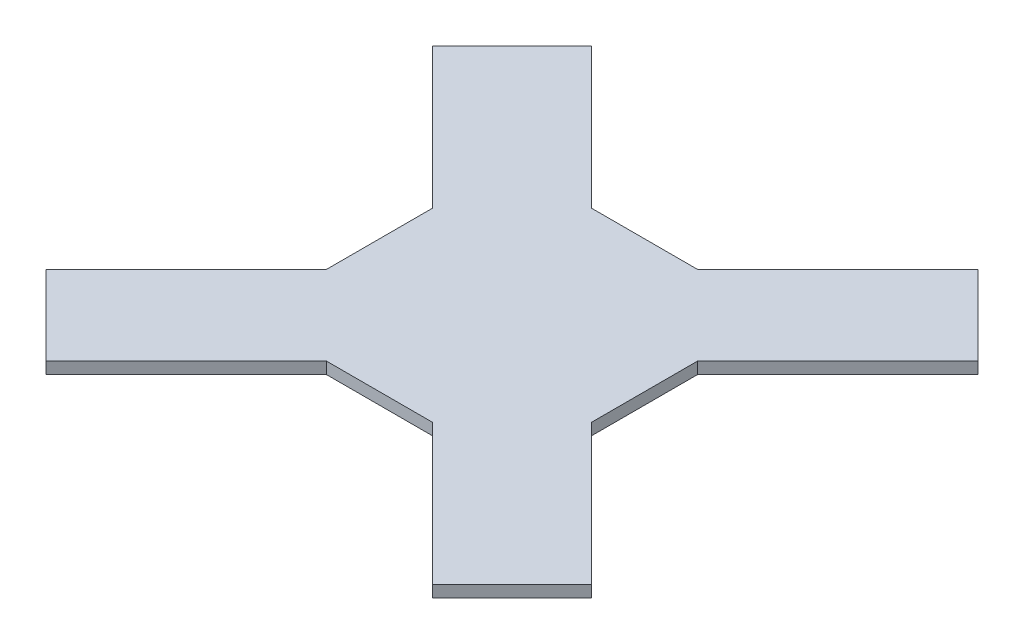
ISO-10303-21;
HEADER;
FILE_DESCRIPTION(('STEP AP214'),'2;1');
FILE_NAME('part.step','',(''),(''),'','','');
FILE_SCHEMA(('AUTOMOTIVE_DESIGN { 1 0 10303 214 1 1 1 1 }'));
ENDSEC;
DATA;
#1=APPLICATION_CONTEXT('core data for automotive mechanical design processes');
#2=APPLICATION_PROTOCOL_DEFINITION('international standard','automotive_design',2000,#1);
#3=PRODUCT_CONTEXT('',#1,'mechanical');
#4=PRODUCT('Part','Part','',(#3));
#5=PRODUCT_RELATED_PRODUCT_CATEGORY('part','',(#4));
#6=PRODUCT_DEFINITION_FORMATION('','',#4);
#7=PRODUCT_DEFINITION_CONTEXT('part definition',#1,'design');
#8=PRODUCT_DEFINITION('design','',#6,#7);
#9=PRODUCT_DEFINITION_SHAPE('','',#8);
#10=(LENGTH_UNIT() NAMED_UNIT(*) SI_UNIT(.MILLI.,.METRE.));
#11=(NAMED_UNIT(*) PLANE_ANGLE_UNIT() SI_UNIT($,.RADIAN.));
#12=(NAMED_UNIT(*) SI_UNIT($,.STERADIAN.) SOLID_ANGLE_UNIT());
#13=UNCERTAINTY_MEASURE_WITH_UNIT(LENGTH_MEASURE(1.E-05),#10,'distance_accuracy_value','');
#14=(GEOMETRIC_REPRESENTATION_CONTEXT(3) GLOBAL_UNCERTAINTY_ASSIGNED_CONTEXT((#13)) GLOBAL_UNIT_ASSIGNED_CONTEXT((#10,
#11,#12)) REPRESENTATION_CONTEXT('',''));
#15=CARTESIAN_POINT('',(0.,0.,0.));
#16=DIRECTION('',(0.,0.,1.));
#17=DIRECTION('',(1.,0.,0.));
#18=AXIS2_PLACEMENT_3D('',#15,#16,#17);
#19=CARTESIAN_POINT('',(-232.530110784354,10.,-164.647859790445));
#20=DIRECTION('',(0.707106781186547,0.,-0.707106781186548));
#21=DIRECTION('',(-0.707106781186548,0.,-0.707106781186547));
#22=AXIS2_PLACEMENT_3D('',#19,#20,#21);
#23=PLANE('',#22);
#24=DIRECTION('',(0.707106781186548,0.,0.707106781186547));
#25=VECTOR('',#24,1.);
#26=CARTESIAN_POINT('',(-232.530110784354,0.,-164.647859790445));
#27=LINE('',#26,#25);
#28=CARTESIAN_POINT('',(-232.530110784354,0.,-164.647859790445));
#29=VERTEX_POINT('',#28);
#30=CARTESIAN_POINT('',(-112.798741958208,0.,-44.9164909642999));
#31=VERTEX_POINT('',#30);
#32=EDGE_CURVE('E194',#29,#31,#27,.T.);
#33=ORIENTED_EDGE('',*,*,#32,.T.);
#34=DIRECTION('',(0.,-1.,0.));
#35=VECTOR('',#34,1.);
#36=CARTESIAN_POINT('',(-112.798741958208,10.,-44.9164909642999));
#37=LINE('',#36,#35);
#38=CARTESIAN_POINT('',(-112.798741958208,10.,-44.9164909642999));
#39=VERTEX_POINT('',#38);
#40=EDGE_CURVE('E11',#39,#31,#37,.T.);
#41=ORIENTED_EDGE('',*,*,#40,.F.);
#42=DIRECTION('',(0.707106781186548,0.,0.707106781186547));
#43=VECTOR('',#42,1.);
#44=CARTESIAN_POINT('',(-232.530110784354,10.,-164.647859790445));
#45=LINE('',#44,#43);
#46=CARTESIAN_POINT('',(-232.530110784354,10.,-164.647859790445));
#47=VERTEX_POINT('',#46);
#48=EDGE_CURVE('E240',#47,#39,#45,.T.);
#49=ORIENTED_EDGE('',*,*,#48,.F.);
#50=DIRECTION('',(0.,-1.,0.));
#51=VECTOR('',#50,1.);
#52=CARTESIAN_POINT('',(-232.530110784354,10.,-164.647859790445));
#53=LINE('',#52,#51);
#54=EDGE_CURVE('E190',#47,#29,#53,.T.);
#55=ORIENTED_EDGE('',*,*,#54,.T.);
#56=EDGE_LOOP('',(#33,#41,#49,#55));
#57=FACE_BOUND('',#56,.T.);
#58=ADVANCED_FACE('F45',(#57),#23,.F.);
#59=CARTESIAN_POINT('',(-112.798741958208,10.,-44.9164909642999));
#60=DIRECTION('',(1.,0.,0.));
#61=DIRECTION('',(0.,0.,-1.));
#62=AXIS2_PLACEMENT_3D('',#59,#60,#61);
#63=PLANE('',#62);
#64=DIRECTION('',(0.,0.,1.));
#65=VECTOR('',#64,1.);
#66=CARTESIAN_POINT('',(-112.798741958208,0.,-44.9164909642999));
#67=LINE('',#66,#65);
#68=CARTESIAN_POINT('',(-112.798741958208,0.,45.4108901399197));
#69=VERTEX_POINT('',#68);
#70=EDGE_CURVE('E198',#31,#69,#67,.T.);
#71=ORIENTED_EDGE('',*,*,#70,.T.);
#72=DIRECTION('',(0.,-1.,0.));
#73=VECTOR('',#72,1.);
#74=CARTESIAN_POINT('',(-112.798741958208,10.,45.4108901399197));
#75=LINE('',#74,#73);
#76=CARTESIAN_POINT('',(-112.798741958208,10.,45.4108901399197));
#77=VERTEX_POINT('',#76);
#78=EDGE_CURVE('E54',#77,#69,#75,.T.);
#79=ORIENTED_EDGE('',*,*,#78,.F.);
#80=DIRECTION('',(0.,0.,1.));
#81=VECTOR('',#80,1.);
#82=CARTESIAN_POINT('',(-112.798741958208,10.,-44.9164909642999));
#83=LINE('',#82,#81);
#84=EDGE_CURVE('E129',#39,#77,#83,.T.);
#85=ORIENTED_EDGE('',*,*,#84,.F.);
#86=ORIENTED_EDGE('',*,*,#40,.T.);
#87=EDGE_LOOP('',(#71,#79,#85,#86));
#88=FACE_BOUND('',#87,.T.);
#89=ADVANCED_FACE('F362',(#88),#63,.F.);
#90=CARTESIAN_POINT('',(-112.798741958208,10.,45.4108901399197));
#91=DIRECTION('',(0.707106781186548,0.,0.707106781186548));
#92=DIRECTION('',(0.707106781186548,0.,-0.707106781186548));
#93=AXIS2_PLACEMENT_3D('',#90,#91,#92);
#94=PLANE('',#93);
#95=DIRECTION('',(-0.707106781186547,0.,0.707106781186547));
#96=VECTOR('',#95,1.);
#97=CARTESIAN_POINT('',(-112.798741958208,0.,45.4108901399197));
#98=LINE('',#97,#96);
#99=CARTESIAN_POINT('',(-232.530110784354,0.,165.142258966065));
#100=VERTEX_POINT('',#99);
#101=EDGE_CURVE('E201',#69,#100,#98,.T.);
#102=ORIENTED_EDGE('',*,*,#101,.T.);
#103=DIRECTION('',(0.,-1.,0.));
#104=VECTOR('',#103,1.);
#105=CARTESIAN_POINT('',(-232.530110784354,10.,165.142258966065));
#106=LINE('',#105,#104);
#107=CARTESIAN_POINT('',(-232.530110784354,10.,165.142258966065));
#108=VERTEX_POINT('',#107);
#109=EDGE_CURVE('E283',#108,#100,#106,.T.);
#110=ORIENTED_EDGE('',*,*,#109,.F.);
#111=DIRECTION('',(-0.707106781186547,0.,0.707106781186547));
#112=VECTOR('',#111,1.);
#113=CARTESIAN_POINT('',(-112.798741958208,10.,45.4108901399197));
#114=LINE('',#113,#112);
#115=EDGE_CURVE('E293',#77,#108,#114,.T.);
#116=ORIENTED_EDGE('',*,*,#115,.F.);
#117=ORIENTED_EDGE('',*,*,#78,.T.);
#118=EDGE_LOOP('',(#102,#110,#116,#117));
#119=FACE_BOUND('',#118,.T.);
#120=ADVANCED_FACE('F291',(#119),#94,.F.);
#121=CARTESIAN_POINT('',(-232.530110784354,10.,165.142258966065));
#122=DIRECTION('',(0.707106781186548,0.,-0.707106781186548));
#123=DIRECTION('',(-0.707106781186548,0.,-0.707106781186548));
#124=AXIS2_PLACEMENT_3D('',#121,#122,#123);
#125=PLANE('',#124);
#126=DIRECTION('',(0.707106781186547,0.,0.707106781186547));
#127=VECTOR('',#126,1.);
#128=CARTESIAN_POINT('',(-232.530110784354,0.,165.142258966065));
#129=LINE('',#128,#127);
#130=CARTESIAN_POINT('',(-164.647859790445,0.,233.024509959974));
#131=VERTEX_POINT('',#130);
#132=EDGE_CURVE('E204',#100,#131,#129,.T.);
#133=ORIENTED_EDGE('',*,*,#132,.T.);
#134=DIRECTION('',(0.,-1.,0.));
#135=VECTOR('',#134,1.);
#136=CARTESIAN_POINT('',(-164.647859790445,10.,233.024509959974));
#137=LINE('',#136,#135);
#138=CARTESIAN_POINT('',(-164.647859790445,10.,233.024509959974));
#139=VERTEX_POINT('',#138);
#140=EDGE_CURVE('E279',#139,#131,#137,.T.);
#141=ORIENTED_EDGE('',*,*,#140,.F.);
#142=DIRECTION('',(0.707106781186547,0.,0.707106781186547));
#143=VECTOR('',#142,1.);
#144=CARTESIAN_POINT('',(-232.530110784354,10.,165.142258966065));
#145=LINE('',#144,#143);
#146=EDGE_CURVE('E312',#108,#139,#145,.T.);
#147=ORIENTED_EDGE('',*,*,#146,.F.);
#148=ORIENTED_EDGE('',*,*,#109,.T.);
#149=EDGE_LOOP('',(#133,#141,#147,#148));
#150=FACE_BOUND('',#149,.T.);
#151=ADVANCED_FACE('F302',(#150),#125,.F.);
#152=CARTESIAN_POINT('',(-164.647859790445,10.,233.024509959974));
#153=DIRECTION('',(-0.707106781186548,0.,-0.707106781186547));
#154=DIRECTION('',(-0.707106781186547,0.,0.707106781186548));
#155=AXIS2_PLACEMENT_3D('',#152,#153,#154);
#156=PLANE('',#155);
#157=DIRECTION('',(0.707106781186547,0.,-0.707106781186548));
#158=VECTOR('',#157,1.);
#159=CARTESIAN_POINT('',(-164.647859790445,0.,233.024509959974));
#160=LINE('',#159,#158);
#161=CARTESIAN_POINT('',(-44.9164909642997,0.,113.293141133828));
#162=VERTEX_POINT('',#161);
#163=EDGE_CURVE('E207',#131,#162,#160,.T.);
#164=ORIENTED_EDGE('',*,*,#163,.T.);
#165=DIRECTION('',(0.,-1.,0.));
#166=VECTOR('',#165,1.);
#167=CARTESIAN_POINT('',(-44.9164909642997,10.,113.293141133828));
#168=LINE('',#167,#166);
#169=CARTESIAN_POINT('',(-44.9164909642997,10.,113.293141133828));
#170=VERTEX_POINT('',#169);
#171=EDGE_CURVE('E275',#170,#162,#168,.T.);
#172=ORIENTED_EDGE('',*,*,#171,.F.);
#173=DIRECTION('',(0.707106781186547,0.,-0.707106781186548));
#174=VECTOR('',#173,1.);
#175=CARTESIAN_POINT('',(-164.647859790445,10.,233.024509959974));
#176=LINE('',#175,#174);
#177=EDGE_CURVE('E308',#139,#170,#176,.T.);
#178=ORIENTED_EDGE('',*,*,#177,.F.);
#179=ORIENTED_EDGE('',*,*,#140,.T.);
#180=EDGE_LOOP('',(#164,#172,#178,#179));
#181=FACE_BOUND('',#180,.T.);
#182=ADVANCED_FACE('F306',(#181),#156,.F.);
#183=CARTESIAN_POINT('',(-44.9164909642997,10.,113.293141133828));
#184=DIRECTION('',(0.,0.,-1.));
#185=DIRECTION('',(-1.,0.,0.));
#186=AXIS2_PLACEMENT_3D('',#183,#184,#185);
#187=PLANE('',#186);
#188=DIRECTION('',(1.,0.,0.));
#189=VECTOR('',#188,1.);
#190=CARTESIAN_POINT('',(-44.9164909642997,0.,113.293141133828));
#191=LINE('',#190,#189);
#192=CARTESIAN_POINT('',(45.4108901399197,0.,113.293141133828));
#193=VERTEX_POINT('',#192);
#194=EDGE_CURVE('E210',#162,#193,#191,.T.);
#195=ORIENTED_EDGE('',*,*,#194,.T.);
#196=DIRECTION('',(0.,-1.,0.));
#197=VECTOR('',#196,1.);
#198=CARTESIAN_POINT('',(45.4108901399197,10.,113.293141133828));
#199=LINE('',#198,#197);
#200=CARTESIAN_POINT('',(45.4108901399197,10.,113.293141133828));
#201=VERTEX_POINT('',#200);
#202=EDGE_CURVE('E271',#201,#193,#199,.T.);
#203=ORIENTED_EDGE('',*,*,#202,.F.);
#204=DIRECTION('',(1.,0.,0.));
#205=VECTOR('',#204,1.);
#206=CARTESIAN_POINT('',(-44.9164909642997,10.,113.293141133828));
#207=LINE('',#206,#205);
#208=EDGE_CURVE('E311',#170,#201,#207,.T.);
#209=ORIENTED_EDGE('',*,*,#208,.F.);
#210=ORIENTED_EDGE('',*,*,#171,.T.);
#211=EDGE_LOOP('',(#195,#203,#209,#210));
#212=FACE_BOUND('',#211,.T.);
#213=ADVANCED_FACE('F375',(#212),#187,.F.);
#214=CARTESIAN_POINT('',(45.4108901399197,10.,113.293141133828));
#215=DIRECTION('',(0.707106781186548,0.,-0.707106781186548));
#216=DIRECTION('',(-0.707106781186548,0.,-0.707106781186548));
#217=AXIS2_PLACEMENT_3D('',#214,#215,#216);
#218=PLANE('',#217);
#219=DIRECTION('',(0.707106781186548,0.,0.707106781186548));
#220=VECTOR('',#219,1.);
#221=CARTESIAN_POINT('',(45.4108901399197,0.,113.293141133828));
#222=LINE('',#221,#220);
#223=CARTESIAN_POINT('',(165.142258966065,0.,233.024509959973));
#224=VERTEX_POINT('',#223);
#225=EDGE_CURVE('E213',#193,#224,#222,.T.);
#226=ORIENTED_EDGE('',*,*,#225,.T.);
#227=DIRECTION('',(0.,-1.,0.));
#228=VECTOR('',#227,1.);
#229=CARTESIAN_POINT('',(165.142258966065,10.,233.024509959973));
#230=LINE('',#229,#228);
#231=CARTESIAN_POINT('',(165.142258966065,10.,233.024509959973));
#232=VERTEX_POINT('',#231);
#233=EDGE_CURVE('E267',#232,#224,#230,.T.);
#234=ORIENTED_EDGE('',*,*,#233,.F.);
#235=DIRECTION('',(0.707106781186548,0.,0.707106781186548));
#236=VECTOR('',#235,1.);
#237=CARTESIAN_POINT('',(45.4108901399197,10.,113.293141133828));
#238=LINE('',#237,#236);
#239=EDGE_CURVE('E316',#201,#232,#238,.T.);
#240=ORIENTED_EDGE('',*,*,#239,.F.);
#241=ORIENTED_EDGE('',*,*,#202,.T.);
#242=EDGE_LOOP('',(#226,#234,#240,#241));
#243=FACE_BOUND('',#242,.T.);
#244=ADVANCED_FACE('F378',(#243),#218,.F.);
#245=CARTESIAN_POINT('',(165.142258966065,10.,233.024509959973));
#246=DIRECTION('',(-0.707106781186548,0.,-0.707106781186548));
#247=DIRECTION('',(-0.707106781186548,0.,0.707106781186548));
#248=AXIS2_PLACEMENT_3D('',#245,#246,#247);
#249=PLANE('',#248);
#250=DIRECTION('',(0.707106781186548,0.,-0.707106781186548));
#251=VECTOR('',#250,1.);
#252=CARTESIAN_POINT('',(165.142258966065,0.,233.024509959973));
#253=LINE('',#252,#251);
#254=CARTESIAN_POINT('',(233.024509959974,0.,165.142258966065));
#255=VERTEX_POINT('',#254);
#256=EDGE_CURVE('E216',#224,#255,#253,.T.);
#257=ORIENTED_EDGE('',*,*,#256,.T.);
#258=DIRECTION('',(0.,-1.,0.));
#259=VECTOR('',#258,1.);
#260=CARTESIAN_POINT('',(233.024509959974,10.,165.142258966065));
#261=LINE('',#260,#259);
#262=CARTESIAN_POINT('',(233.024509959974,10.,165.142258966065));
#263=VERTEX_POINT('',#262);
#264=EDGE_CURVE('E263',#263,#255,#261,.T.);
#265=ORIENTED_EDGE('',*,*,#264,.F.);
#266=DIRECTION('',(0.707106781186548,0.,-0.707106781186548));
#267=VECTOR('',#266,1.);
#268=CARTESIAN_POINT('',(165.142258966065,10.,233.024509959973));
#269=LINE('',#268,#267);
#270=EDGE_CURVE('E323',#232,#263,#269,.T.);
#271=ORIENTED_EDGE('',*,*,#270,.F.);
#272=ORIENTED_EDGE('',*,*,#233,.T.);
#273=EDGE_LOOP('',(#257,#265,#271,#272));
#274=FACE_BOUND('',#273,.T.);
#275=ADVANCED_FACE('F382',(#274),#249,.F.);
#276=CARTESIAN_POINT('',(233.024509959974,10.,165.142258966065));
#277=DIRECTION('',(-0.707106781186548,0.,0.707106781186547));
#278=DIRECTION('',(0.707106781186547,0.,0.707106781186548));
#279=AXIS2_PLACEMENT_3D('',#276,#277,#278);
#280=PLANE('',#279);
#281=DIRECTION('',(-0.707106781186547,0.,-0.707106781186548));
#282=VECTOR('',#281,1.);
#283=CARTESIAN_POINT('',(233.024509959974,0.,165.142258966065));
#284=LINE('',#283,#282);
#285=CARTESIAN_POINT('',(113.293141133828,0.,45.4108901399198));
#286=VERTEX_POINT('',#285);
#287=EDGE_CURVE('E219',#255,#286,#284,.T.);
#288=ORIENTED_EDGE('',*,*,#287,.T.);
#289=DIRECTION('',(0.,-1.,0.));
#290=VECTOR('',#289,1.);
#291=CARTESIAN_POINT('',(113.293141133828,10.,45.4108901399198));
#292=LINE('',#291,#290);
#293=CARTESIAN_POINT('',(113.293141133828,10.,45.4108901399198));
#294=VERTEX_POINT('',#293);
#295=EDGE_CURVE('E259',#294,#286,#292,.T.);
#296=ORIENTED_EDGE('',*,*,#295,.F.);
#297=DIRECTION('',(-0.707106781186547,0.,-0.707106781186548));
#298=VECTOR('',#297,1.);
#299=CARTESIAN_POINT('',(233.024509959974,10.,165.142258966065));
#300=LINE('',#299,#298);
#301=EDGE_CURVE('E326',#263,#294,#300,.T.);
#302=ORIENTED_EDGE('',*,*,#301,.F.);
#303=ORIENTED_EDGE('',*,*,#264,.T.);
#304=EDGE_LOOP('',(#288,#296,#302,#303));
#305=FACE_BOUND('',#304,.T.);
#306=ADVANCED_FACE('F386',(#305),#280,.F.);
#307=CARTESIAN_POINT('',(113.293141133828,10.,45.4108901399198));
#308=DIRECTION('',(-1.,0.,0.));
#309=DIRECTION('',(0.,0.,1.));
#310=AXIS2_PLACEMENT_3D('',#307,#308,#309);
#311=PLANE('',#310);
#312=DIRECTION('',(0.,0.,-1.));
#313=VECTOR('',#312,1.);
#314=CARTESIAN_POINT('',(113.293141133828,0.,45.4108901399198));
#315=LINE('',#314,#313);
#316=CARTESIAN_POINT('',(113.293141133828,0.,-44.9164909643));
#317=VERTEX_POINT('',#316);
#318=EDGE_CURVE('E222',#286,#317,#315,.T.);
#319=ORIENTED_EDGE('',*,*,#318,.T.);
#320=DIRECTION('',(0.,-1.,0.));
#321=VECTOR('',#320,1.);
#322=CARTESIAN_POINT('',(113.293141133828,10.,-44.9164909643));
#323=LINE('',#322,#321);
#324=CARTESIAN_POINT('',(113.293141133828,10.,-44.9164909643));
#325=VERTEX_POINT('',#324);
#326=EDGE_CURVE('E255',#325,#317,#323,.T.);
#327=ORIENTED_EDGE('',*,*,#326,.F.);
#328=DIRECTION('',(0.,0.,-1.));
#329=VECTOR('',#328,1.);
#330=CARTESIAN_POINT('',(113.293141133828,10.,45.4108901399198));
#331=LINE('',#330,#329);
#332=EDGE_CURVE('E329',#294,#325,#331,.T.);
#333=ORIENTED_EDGE('',*,*,#332,.F.);
#334=ORIENTED_EDGE('',*,*,#295,.T.);
#335=EDGE_LOOP('',(#319,#327,#333,#334));
#336=FACE_BOUND('',#335,.T.);
#337=ADVANCED_FACE('F390',(#336),#311,.F.);
#338=CARTESIAN_POINT('',(113.293141133828,10.,-44.9164909643));
#339=DIRECTION('',(-0.707106781186548,0.,-0.707106781186547));
#340=DIRECTION('',(-0.707106781186547,0.,0.707106781186548));
#341=AXIS2_PLACEMENT_3D('',#338,#339,#340);
#342=PLANE('',#341);
#343=DIRECTION('',(0.707106781186547,0.,-0.707106781186548));
#344=VECTOR('',#343,1.);
#345=CARTESIAN_POINT('',(113.293141133828,0.,-44.9164909643));
#346=LINE('',#345,#344);
#347=CARTESIAN_POINT('',(233.024509959973,0.,-164.647859790445));
#348=VERTEX_POINT('',#347);
#349=EDGE_CURVE('E225',#317,#348,#346,.T.);
#350=ORIENTED_EDGE('',*,*,#349,.T.);
#351=DIRECTION('',(0.,-1.,0.));
#352=VECTOR('',#351,1.);
#353=CARTESIAN_POINT('',(233.024509959973,10.,-164.647859790445));
#354=LINE('',#353,#352);
#355=CARTESIAN_POINT('',(233.024509959973,10.,-164.647859790445));
#356=VERTEX_POINT('',#355);
#357=EDGE_CURVE('E251',#356,#348,#354,.T.);
#358=ORIENTED_EDGE('',*,*,#357,.F.);
#359=DIRECTION('',(0.707106781186547,0.,-0.707106781186548));
#360=VECTOR('',#359,1.);
#361=CARTESIAN_POINT('',(113.293141133828,10.,-44.9164909643));
#362=LINE('',#361,#360);
#363=EDGE_CURVE('E332',#325,#356,#362,.T.);
#364=ORIENTED_EDGE('',*,*,#363,.F.);
#365=ORIENTED_EDGE('',*,*,#326,.T.);
#366=EDGE_LOOP('',(#350,#358,#364,#365));
#367=FACE_BOUND('',#366,.T.);
#368=ADVANCED_FACE('F394',(#367),#342,.F.);
#369=CARTESIAN_POINT('',(233.024509959973,10.,-164.647859790445));
#370=DIRECTION('',(-0.707106781186548,0.,0.707106781186548));
#371=DIRECTION('',(0.707106781186548,0.,0.707106781186548));
#372=AXIS2_PLACEMENT_3D('',#369,#370,#371);
#373=PLANE('',#372);
#374=DIRECTION('',(-0.707106781186548,0.,-0.707106781186548));
#375=VECTOR('',#374,1.);
#376=CARTESIAN_POINT('',(233.024509959973,0.,-164.647859790445));
#377=LINE('',#376,#375);
#378=CARTESIAN_POINT('',(165.142258966065,0.,-232.530110784354));
#379=VERTEX_POINT('',#378);
#380=EDGE_CURVE('E228',#348,#379,#377,.T.);
#381=ORIENTED_EDGE('',*,*,#380,.T.);
#382=DIRECTION('',(0.,-1.,0.));
#383=VECTOR('',#382,1.);
#384=CARTESIAN_POINT('',(165.142258966065,10.,-232.530110784354));
#385=LINE('',#384,#383);
#386=CARTESIAN_POINT('',(165.142258966065,10.,-232.530110784354));
#387=VERTEX_POINT('',#386);
#388=EDGE_CURVE('E247',#387,#379,#385,.T.);
#389=ORIENTED_EDGE('',*,*,#388,.F.);
#390=DIRECTION('',(-0.707106781186548,0.,-0.707106781186548));
#391=VECTOR('',#390,1.);
#392=CARTESIAN_POINT('',(233.024509959973,10.,-164.647859790445));
#393=LINE('',#392,#391);
#394=EDGE_CURVE('E335',#356,#387,#393,.T.);
#395=ORIENTED_EDGE('',*,*,#394,.F.);
#396=ORIENTED_EDGE('',*,*,#357,.T.);
#397=EDGE_LOOP('',(#381,#389,#395,#396));
#398=FACE_BOUND('',#397,.T.);
#399=ADVANCED_FACE('F343',(#398),#373,.F.);
#400=CARTESIAN_POINT('',(165.142258966065,10.,-232.530110784354));
#401=DIRECTION('',(0.707106781186548,0.,0.707106781186547));
#402=DIRECTION('',(0.707106781186547,0.,-0.707106781186548));
#403=AXIS2_PLACEMENT_3D('',#400,#401,#402);
#404=PLANE('',#403);
#405=DIRECTION('',(-0.707106781186547,0.,0.707106781186548));
#406=VECTOR('',#405,1.);
#407=CARTESIAN_POINT('',(165.142258966065,0.,-232.530110784354));
#408=LINE('',#407,#406);
#409=CARTESIAN_POINT('',(45.4108901399199,0.,-112.798741958208));
#410=VERTEX_POINT('',#409);
#411=EDGE_CURVE('E231',#379,#410,#408,.T.);
#412=ORIENTED_EDGE('',*,*,#411,.T.);
#413=DIRECTION('',(0.,-1.,0.));
#414=VECTOR('',#413,1.);
#415=CARTESIAN_POINT('',(45.4108901399199,10.,-112.798741958208));
#416=LINE('',#415,#414);
#417=CARTESIAN_POINT('',(45.4108901399199,10.,-112.798741958208));
#418=VERTEX_POINT('',#417);
#419=EDGE_CURVE('E183',#418,#410,#416,.T.);
#420=ORIENTED_EDGE('',*,*,#419,.F.);
#421=DIRECTION('',(-0.707106781186547,0.,0.707106781186548));
#422=VECTOR('',#421,1.);
#423=CARTESIAN_POINT('',(165.142258966065,10.,-232.530110784354));
#424=LINE('',#423,#422);
#425=EDGE_CURVE('E172',#387,#418,#424,.T.);
#426=ORIENTED_EDGE('',*,*,#425,.F.);
#427=ORIENTED_EDGE('',*,*,#388,.T.);
#428=EDGE_LOOP('',(#412,#420,#426,#427));
#429=FACE_BOUND('',#428,.T.);
#430=ADVANCED_FACE('F347',(#429),#404,.F.);
#431=CARTESIAN_POINT('',(45.4108901399199,10.,-112.798741958208));
#432=DIRECTION('',(0.,0.,1.));
#433=DIRECTION('',(1.,0.,0.));
#434=AXIS2_PLACEMENT_3D('',#431,#432,#433);
#435=PLANE('',#434);
#436=DIRECTION('',(-1.,0.,0.));
#437=VECTOR('',#436,1.);
#438=CARTESIAN_POINT('',(45.4108901399199,0.,-112.798741958208));
#439=LINE('',#438,#437);
#440=CARTESIAN_POINT('',(-44.9164909642999,0.,-112.798741958208));
#441=VERTEX_POINT('',#440);
#442=EDGE_CURVE('E181',#410,#441,#439,.T.);
#443=ORIENTED_EDGE('',*,*,#442,.T.);
#444=DIRECTION('',(0.,-1.,0.));
#445=VECTOR('',#444,1.);
#446=CARTESIAN_POINT('',(-44.9164909642999,10.,-112.798741958208));
#447=LINE('',#446,#445);
#448=CARTESIAN_POINT('',(-44.9164909642999,10.,-112.798741958208));
#449=VERTEX_POINT('',#448);
#450=EDGE_CURVE('E178',#449,#441,#447,.T.);
#451=ORIENTED_EDGE('',*,*,#450,.F.);
#452=DIRECTION('',(-1.,0.,0.));
#453=VECTOR('',#452,1.);
#454=CARTESIAN_POINT('',(45.4108901399199,10.,-112.798741958208));
#455=LINE('',#454,#453);
#456=EDGE_CURVE('E166',#418,#449,#455,.T.);
#457=ORIENTED_EDGE('',*,*,#456,.F.);
#458=ORIENTED_EDGE('',*,*,#419,.T.);
#459=EDGE_LOOP('',(#443,#451,#457,#458));
#460=FACE_BOUND('',#459,.T.);
#461=ADVANCED_FACE('F179',(#460),#435,.F.);
#462=CARTESIAN_POINT('',(-44.9164909642999,10.,-112.798741958208));
#463=DIRECTION('',(-0.707106781186548,0.,0.707106781186548));
#464=DIRECTION('',(0.707106781186548,0.,0.707106781186548));
#465=AXIS2_PLACEMENT_3D('',#462,#463,#464);
#466=PLANE('',#465);
#467=DIRECTION('',(-0.707106781186548,0.,-0.707106781186548));
#468=VECTOR('',#467,1.);
#469=CARTESIAN_POINT('',(-44.9164909642999,0.,-112.798741958208));
#470=LINE('',#469,#468);
#471=CARTESIAN_POINT('',(-164.647859790445,0.,-232.530110784354));
#472=VERTEX_POINT('',#471);
#473=EDGE_CURVE('E115',#441,#472,#470,.T.);
#474=ORIENTED_EDGE('',*,*,#473,.T.);
#475=DIRECTION('',(0.,-1.,0.));
#476=VECTOR('',#475,1.);
#477=CARTESIAN_POINT('',(-164.647859790445,10.,-232.530110784354));
#478=LINE('',#477,#476);
#479=CARTESIAN_POINT('',(-164.647859790445,10.,-232.530110784354));
#480=VERTEX_POINT('',#479);
#481=EDGE_CURVE('E184',#480,#472,#478,.T.);
#482=ORIENTED_EDGE('',*,*,#481,.F.);
#483=DIRECTION('',(-0.707106781186548,0.,-0.707106781186548));
#484=VECTOR('',#483,1.);
#485=CARTESIAN_POINT('',(-44.9164909642999,10.,-112.798741958208));
#486=LINE('',#485,#484);
#487=EDGE_CURVE('E170',#449,#480,#486,.T.);
#488=ORIENTED_EDGE('',*,*,#487,.F.);
#489=ORIENTED_EDGE('',*,*,#450,.T.);
#490=EDGE_LOOP('',(#474,#482,#488,#489));
#491=FACE_BOUND('',#490,.T.);
#492=ADVANCED_FACE('F186',(#491),#466,.F.);
#493=CARTESIAN_POINT('',(-164.647859790445,10.,-232.530110784354));
#494=DIRECTION('',(0.707106781186548,0.,0.707106781186547));
#495=DIRECTION('',(0.707106781186547,0.,-0.707106781186548));
#496=AXIS2_PLACEMENT_3D('',#493,#494,#495);
#497=PLANE('',#496);
#498=DIRECTION('',(-0.707106781186547,0.,0.707106781186548));
#499=VECTOR('',#498,1.);
#500=CARTESIAN_POINT('',(-164.647859790445,0.,-232.530110784354));
#501=LINE('',#500,#499);
#502=EDGE_CURVE('E121',#472,#29,#501,.T.);
#503=ORIENTED_EDGE('',*,*,#502,.T.);
#504=ORIENTED_EDGE('',*,*,#54,.F.);
#505=DIRECTION('',(-0.707106781186547,0.,0.707106781186548));
#506=VECTOR('',#505,1.);
#507=CARTESIAN_POINT('',(-164.647859790445,10.,-232.530110784354));
#508=LINE('',#507,#506);
#509=EDGE_CURVE('E62',#480,#47,#508,.T.);
#510=ORIENTED_EDGE('',*,*,#509,.F.);
#511=ORIENTED_EDGE('',*,*,#481,.T.);
#512=EDGE_LOOP('',(#503,#504,#510,#511));
#513=FACE_BOUND('',#512,.T.);
#514=ADVANCED_FACE('F351',(#513),#497,.F.);
#515=CARTESIAN_POINT('',(0.,10.,0.));
#516=DIRECTION('',(0.,-1.,0.));
#517=DIRECTION('',(0.,0.,-1.));
#518=AXIS2_PLACEMENT_3D('',#515,#516,#517);
#519=PLANE('',#518);
#520=ORIENTED_EDGE('',*,*,#48,.T.);
#521=ORIENTED_EDGE('',*,*,#84,.T.);
#522=ORIENTED_EDGE('',*,*,#115,.T.);
#523=ORIENTED_EDGE('',*,*,#146,.T.);
#524=ORIENTED_EDGE('',*,*,#177,.T.);
#525=ORIENTED_EDGE('',*,*,#208,.T.);
#526=ORIENTED_EDGE('',*,*,#239,.T.);
#527=ORIENTED_EDGE('',*,*,#270,.T.);
#528=ORIENTED_EDGE('',*,*,#301,.T.);
#529=ORIENTED_EDGE('',*,*,#332,.T.);
#530=ORIENTED_EDGE('',*,*,#363,.T.);
#531=ORIENTED_EDGE('',*,*,#394,.T.);
#532=ORIENTED_EDGE('',*,*,#425,.T.);
#533=ORIENTED_EDGE('',*,*,#456,.T.);
#534=ORIENTED_EDGE('',*,*,#487,.T.);
#535=ORIENTED_EDGE('',*,*,#509,.T.);
#536=EDGE_LOOP('',(#520,#521,#522,#523,#524,#525,#526,#527,#528,#529,#530,#531,#532,#533,#534,#535));
#537=FACE_BOUND('',#536,.T.);
#538=ADVANCED_FACE('F168',(#537),#519,.F.);
#539=CARTESIAN_POINT('',(0.,0.,0.));
#540=DIRECTION('',(0.,-1.,0.));
#541=DIRECTION('',(0.,0.,-1.));
#542=AXIS2_PLACEMENT_3D('',#539,#540,#541);
#543=PLANE('',#542);
#544=ORIENTED_EDGE('',*,*,#32,.F.);
#545=ORIENTED_EDGE('',*,*,#502,.F.);
#546=ORIENTED_EDGE('',*,*,#473,.F.);
#547=ORIENTED_EDGE('',*,*,#442,.F.);
#548=ORIENTED_EDGE('',*,*,#411,.F.);
#549=ORIENTED_EDGE('',*,*,#380,.F.);
#550=ORIENTED_EDGE('',*,*,#349,.F.);
#551=ORIENTED_EDGE('',*,*,#318,.F.);
#552=ORIENTED_EDGE('',*,*,#287,.F.);
#553=ORIENTED_EDGE('',*,*,#256,.F.);
#554=ORIENTED_EDGE('',*,*,#225,.F.);
#555=ORIENTED_EDGE('',*,*,#194,.F.);
#556=ORIENTED_EDGE('',*,*,#163,.F.);
#557=ORIENTED_EDGE('',*,*,#132,.F.);
#558=ORIENTED_EDGE('',*,*,#101,.F.);
#559=ORIENTED_EDGE('',*,*,#70,.F.);
#560=EDGE_LOOP('',(#544,#545,#546,#547,#548,#549,#550,#551,#552,#553,#554,#555,#556,#557,#558,#559));
#561=FACE_BOUND('',#560,.T.);
#562=ADVANCED_FACE('F297',(#561),#543,.T.);
#563=CLOSED_SHELL('',(#58,#89,#120,#151,#182,#213,#244,#275,#306,#337,#368,#399,#430,#461,#492,
#514,#538,#562));
#564=MANIFOLD_SOLID_BREP('B2',#563);
#565=ADVANCED_BREP_SHAPE_REPRESENTATION('',(#18,#564),#14);
#566=SHAPE_DEFINITION_REPRESENTATION(#9,#565);
ENDSEC;
END-ISO-10303-21;
